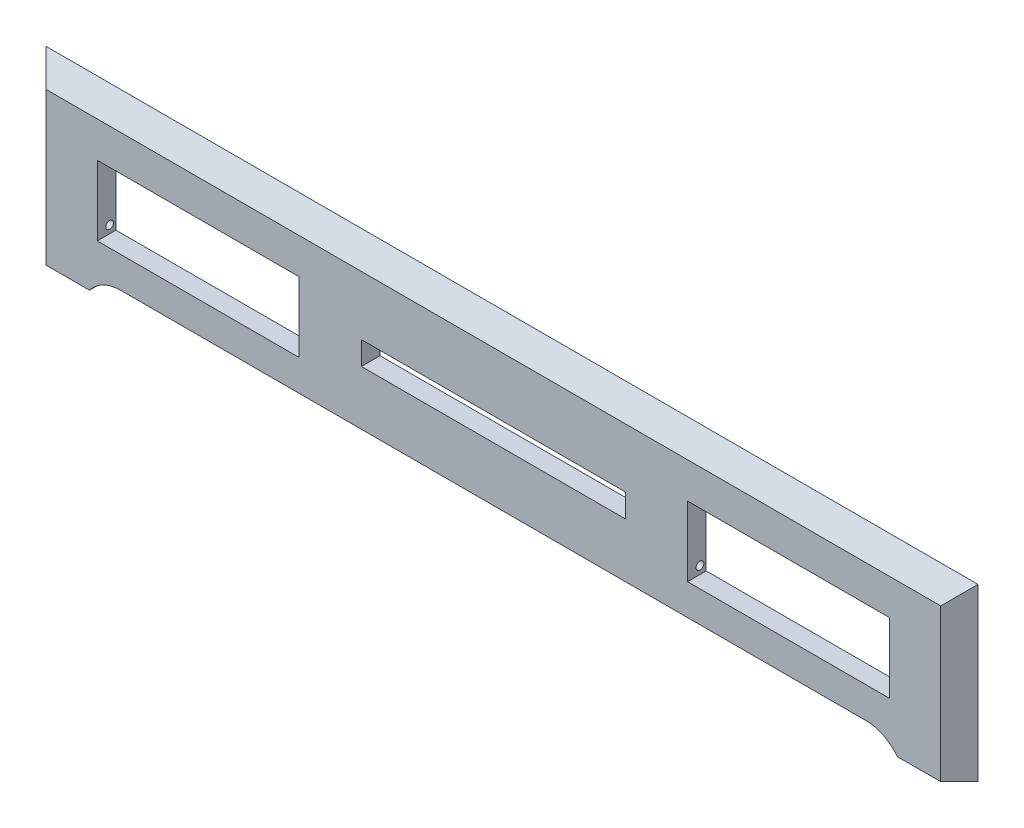
ISO-10303-21;
HEADER;
FILE_DESCRIPTION(('STEP AP214'),'2;1');
FILE_NAME('part.step','',(''),(''),'','','');
FILE_SCHEMA(('AUTOMOTIVE_DESIGN { 1 0 10303 214 1 1 1 1 }'));
ENDSEC;
DATA;
#1=APPLICATION_CONTEXT('core data for automotive mechanical design processes');
#2=APPLICATION_PROTOCOL_DEFINITION('international standard','automotive_design',2000,#1);
#3=PRODUCT_CONTEXT('',#1,'mechanical');
#4=PRODUCT('Part','Part','',(#3));
#5=PRODUCT_RELATED_PRODUCT_CATEGORY('part','',(#4));
#6=PRODUCT_DEFINITION_FORMATION('','',#4);
#7=PRODUCT_DEFINITION_CONTEXT('part definition',#1,'design');
#8=PRODUCT_DEFINITION('design','',#6,#7);
#9=PRODUCT_DEFINITION_SHAPE('','',#8);
#10=(LENGTH_UNIT() NAMED_UNIT(*) SI_UNIT(.MILLI.,.METRE.));
#11=(NAMED_UNIT(*) PLANE_ANGLE_UNIT() SI_UNIT($,.RADIAN.));
#12=(NAMED_UNIT(*) SI_UNIT($,.STERADIAN.) SOLID_ANGLE_UNIT());
#13=UNCERTAINTY_MEASURE_WITH_UNIT(LENGTH_MEASURE(1.E-05),#10,'distance_accuracy_value','');
#14=(GEOMETRIC_REPRESENTATION_CONTEXT(3) GLOBAL_UNCERTAINTY_ASSIGNED_CONTEXT((#13)) GLOBAL_UNIT_ASSIGNED_CONTEXT((#10,
#11,#12)) REPRESENTATION_CONTEXT('',''));
#15=CARTESIAN_POINT('',(0.,0.,0.));
#16=DIRECTION('',(0.,0.,1.));
#17=DIRECTION('',(1.,0.,0.));
#18=AXIS2_PLACEMENT_3D('',#15,#16,#17);
#19=CARTESIAN_POINT('',(0.,-10.,12.));
#20=DIRECTION('',(0.,1.,0.));
#21=DIRECTION('',(-1.,0.,0.));
#22=AXIS2_PLACEMENT_3D('',#19,#20,#21);
#23=PLANE('',#22);
#24=DIRECTION('',(1.,0.,0.));
#25=VECTOR('',#24,1.);
#26=CARTESIAN_POINT('',(0.,-10.,12.));
#27=LINE('',#26,#25);
#28=CARTESIAN_POINT('',(12.0000000000001,-10.,12.));
#29=VERTEX_POINT('',#28);
#30=CARTESIAN_POINT('',(40.,-10.,12.));
#31=VERTEX_POINT('',#30);
#32=EDGE_CURVE('E335',#29,#31,#27,.T.);
#33=ORIENTED_EDGE('',*,*,#32,.F.);
#34=DIRECTION('',(-0.707106781186547,0.,-0.707106781186548));
#35=VECTOR('',#34,1.);
#36=CARTESIAN_POINT('',(12.0000000000001,-10.,12.));
#37=LINE('',#36,#35);
#38=CARTESIAN_POINT('',(0.,-10.,0.));
#39=VERTEX_POINT('',#38);
#40=EDGE_CURVE('E13',#29,#39,#37,.T.);
#41=ORIENTED_EDGE('',*,*,#40,.T.);
#42=DIRECTION('',(1.,0.,0.));
#43=VECTOR('',#42,1.);
#44=CARTESIAN_POINT('',(0.,-10.,0.));
#45=LINE('',#44,#43);
#46=CARTESIAN_POINT('',(40.,-10.,0.));
#47=VERTEX_POINT('',#46);
#48=EDGE_CURVE('E356',#39,#47,#45,.T.);
#49=ORIENTED_EDGE('',*,*,#48,.T.);
#50=DIRECTION('',(0.,0.,-1.));
#51=VECTOR('',#50,1.);
#52=CARTESIAN_POINT('',(40.,-10.,12.));
#53=LINE('',#52,#51);
#54=EDGE_CURVE('E389',#31,#47,#53,.T.);
#55=ORIENTED_EDGE('',*,*,#54,.F.);
#56=EDGE_LOOP('',(#33,#41,#49,#55));
#57=FACE_BOUND('',#56,.T.);
#58=ADVANCED_FACE('F45',(#57),#23,.F.);
#59=CARTESIAN_POINT('',(60.,-25.,12.));
#60=DIRECTION('',(0.,0.,-1.));
#61=DIRECTION('',(-1.,0.,0.));
#62=AXIS2_PLACEMENT_3D('',#59,#60,#61);
#63=CYLINDRICAL_SURFACE('',#62,25.);
#64=CARTESIAN_POINT('',(60.,-25.,0.));
#65=DIRECTION('',(0.,0.,-1.));
#66=DIRECTION('',(-1.,0.,0.));
#67=AXIS2_PLACEMENT_3D('',#64,#65,#66);
#68=CIRCLE('',#67,25.);
#69=CARTESIAN_POINT('',(60.,0.,0.));
#70=VERTEX_POINT('',#69);
#71=EDGE_CURVE('E359',#47,#70,#68,.T.);
#72=ORIENTED_EDGE('',*,*,#71,.T.);
#73=DIRECTION('',(0.,0.,-1.));
#74=VECTOR('',#73,1.);
#75=CARTESIAN_POINT('',(60.,0.,12.));
#76=LINE('',#75,#74);
#77=CARTESIAN_POINT('',(60.,0.,12.));
#78=VERTEX_POINT('',#77);
#79=EDGE_CURVE('E385',#78,#70,#76,.T.);
#80=ORIENTED_EDGE('',*,*,#79,.F.);
#81=CARTESIAN_POINT('',(60.,-25.,12.));
#82=DIRECTION('',(0.,0.,-1.));
#83=DIRECTION('',(-1.,0.,0.));
#84=AXIS2_PLACEMENT_3D('',#81,#82,#83);
#85=CIRCLE('',#84,25.);
#86=EDGE_CURVE('E338',#31,#78,#85,.T.);
#87=ORIENTED_EDGE('',*,*,#86,.F.);
#88=ORIENTED_EDGE('',*,*,#54,.T.);
#89=EDGE_LOOP('',(#72,#80,#87,#88));
#90=FACE_BOUND('',#89,.T.);
#91=ADVANCED_FACE('F454',(#90),#63,.F.);
#92=CARTESIAN_POINT('',(60.,0.,12.));
#93=DIRECTION('',(0.,1.,0.));
#94=DIRECTION('',(0.,0.,1.));
#95=AXIS2_PLACEMENT_3D('',#92,#93,#94);
#96=PLANE('',#95);
#97=DIRECTION('',(1.,0.,0.));
#98=VECTOR('',#97,1.);
#99=CARTESIAN_POINT('',(60.,0.,0.));
#100=LINE('',#99,#98);
#101=CARTESIAN_POINT('',(540.,0.,0.));
#102=VERTEX_POINT('',#101);
#103=EDGE_CURVE('E362',#70,#102,#100,.T.);
#104=ORIENTED_EDGE('',*,*,#103,.T.);
#105=DIRECTION('',(0.,0.,-1.));
#106=VECTOR('',#105,1.);
#107=CARTESIAN_POINT('',(540.,0.,12.));
#108=LINE('',#107,#106);
#109=CARTESIAN_POINT('',(540.,0.,12.));
#110=VERTEX_POINT('',#109);
#111=EDGE_CURVE('E381',#110,#102,#108,.T.);
#112=ORIENTED_EDGE('',*,*,#111,.F.);
#113=DIRECTION('',(1.,0.,0.));
#114=VECTOR('',#113,1.);
#115=CARTESIAN_POINT('',(60.,0.,12.));
#116=LINE('',#115,#114);
#117=EDGE_CURVE('E342',#78,#110,#116,.T.);
#118=ORIENTED_EDGE('',*,*,#117,.F.);
#119=ORIENTED_EDGE('',*,*,#79,.T.);
#120=EDGE_LOOP('',(#104,#112,#118,#119));
#121=FACE_BOUND('',#120,.T.);
#122=ADVANCED_FACE('F460',(#121),#96,.F.);
#123=CARTESIAN_POINT('',(540.,-25.,12.));
#124=DIRECTION('',(0.,0.,-1.));
#125=DIRECTION('',(-1.,0.,0.));
#126=AXIS2_PLACEMENT_3D('',#123,#124,#125);
#127=CYLINDRICAL_SURFACE('',#126,25.);
#128=CARTESIAN_POINT('',(540.,-25.,0.));
#129=DIRECTION('',(0.,0.,-1.));
#130=DIRECTION('',(1.,0.,0.));
#131=AXIS2_PLACEMENT_3D('',#128,#129,#130);
#132=CIRCLE('',#131,25.);
#133=CARTESIAN_POINT('',(560.,-10.,0.));
#134=VERTEX_POINT('',#133);
#135=EDGE_CURVE('E365',#102,#134,#132,.T.);
#136=ORIENTED_EDGE('',*,*,#135,.T.);
#137=DIRECTION('',(0.,0.,-1.));
#138=VECTOR('',#137,1.);
#139=CARTESIAN_POINT('',(560.,-10.,12.));
#140=LINE('',#139,#138);
#141=CARTESIAN_POINT('',(560.,-10.,12.));
#142=VERTEX_POINT('',#141);
#143=EDGE_CURVE('E352',#142,#134,#140,.T.);
#144=ORIENTED_EDGE('',*,*,#143,.F.);
#145=CARTESIAN_POINT('',(540.,-25.,12.));
#146=DIRECTION('',(0.,0.,-1.));
#147=DIRECTION('',(1.,0.,0.));
#148=AXIS2_PLACEMENT_3D('',#145,#146,#147);
#149=CIRCLE('',#148,25.);
#150=EDGE_CURVE('E345',#110,#142,#149,.T.);
#151=ORIENTED_EDGE('',*,*,#150,.F.);
#152=ORIENTED_EDGE('',*,*,#111,.T.);
#153=EDGE_LOOP('',(#136,#144,#151,#152));
#154=FACE_BOUND('',#153,.T.);
#155=ADVANCED_FACE('F498',(#154),#127,.F.);
#156=CARTESIAN_POINT('',(600.,-10.,12.));
#157=DIRECTION('',(0.,1.,0.));
#158=DIRECTION('',(-1.,0.,0.));
#159=AXIS2_PLACEMENT_3D('',#156,#157,#158);
#160=PLANE('',#159);
#161=DIRECTION('',(1.,0.,0.));
#162=VECTOR('',#161,1.);
#163=CARTESIAN_POINT('',(600.,-10.,0.));
#164=LINE('',#163,#162);
#165=CARTESIAN_POINT('',(600.,-10.,0.));
#166=VERTEX_POINT('',#165);
#167=EDGE_CURVE('E368',#134,#166,#164,.T.);
#168=ORIENTED_EDGE('',*,*,#167,.T.);
#169=DIRECTION('',(-0.707106781186548,0.,0.707106781186548));
#170=VECTOR('',#169,1.);
#171=CARTESIAN_POINT('',(588.,-10.,12.));
#172=LINE('',#171,#170);
#173=CARTESIAN_POINT('',(588.,-10.,12.));
#174=VERTEX_POINT('',#173);
#175=EDGE_CURVE('E56',#166,#174,#172,.T.);
#176=ORIENTED_EDGE('',*,*,#175,.T.);
#177=DIRECTION('',(1.,0.,0.));
#178=VECTOR('',#177,1.);
#179=CARTESIAN_POINT('',(600.,-10.,12.));
#180=LINE('',#179,#178);
#181=EDGE_CURVE('E348',#142,#174,#180,.T.);
#182=ORIENTED_EDGE('',*,*,#181,.F.);
#183=ORIENTED_EDGE('',*,*,#143,.T.);
#184=EDGE_LOOP('',(#168,#176,#182,#183));
#185=FACE_BOUND('',#184,.T.);
#186=ADVANCED_FACE('F502',(#185),#160,.F.);
#187=CARTESIAN_POINT('',(540.,-25.,12.));
#188=DIRECTION('',(0.,0.,1.));
#189=DIRECTION('',(1.,0.,0.));
#190=AXIS2_PLACEMENT_3D('',#187,#188,#189);
#191=PLANE('',#190);
#192=DIRECTION('',(0.,-1.,0.));
#193=VECTOR('',#192,1.);
#194=CARTESIAN_POINT('',(45.,65.,12.));
#195=LINE('',#194,#193);
#196=CARTESIAN_POINT('',(45.,65.,12.));
#197=VERTEX_POINT('',#196);
#198=CARTESIAN_POINT('',(45.,20.,12.));
#199=VERTEX_POINT('',#198);
#200=EDGE_CURVE('E194',#197,#199,#195,.T.);
#201=ORIENTED_EDGE('',*,*,#200,.F.);
#202=DIRECTION('',(-1.,0.,0.));
#203=VECTOR('',#202,1.);
#204=CARTESIAN_POINT('',(45.,65.,12.));
#205=LINE('',#204,#203);
#206=CARTESIAN_POINT('',(175.,65.,12.));
#207=VERTEX_POINT('',#206);
#208=EDGE_CURVE('E215',#207,#197,#205,.T.);
#209=ORIENTED_EDGE('',*,*,#208,.F.);
#210=DIRECTION('',(0.,1.,0.));
#211=VECTOR('',#210,1.);
#212=CARTESIAN_POINT('',(175.,65.,12.));
#213=LINE('',#212,#211);
#214=CARTESIAN_POINT('',(175.,20.,12.));
#215=VERTEX_POINT('',#214);
#216=EDGE_CURVE('E219',#215,#207,#213,.T.);
#217=ORIENTED_EDGE('',*,*,#216,.F.);
#218=DIRECTION('',(1.,0.,0.));
#219=VECTOR('',#218,1.);
#220=CARTESIAN_POINT('',(45.,20.,12.));
#221=LINE('',#220,#219);
#222=EDGE_CURVE('E231',#199,#215,#221,.T.);
#223=ORIENTED_EDGE('',*,*,#222,.F.);
#224=EDGE_LOOP('',(#201,#209,#217,#223));
#225=FACE_BOUND('',#224,.T.);
#226=DIRECTION('',(0.,-1.,0.));
#227=VECTOR('',#226,1.);
#228=CARTESIAN_POINT('',(215.,50.,12.));
#229=LINE('',#228,#227);
#230=CARTESIAN_POINT('',(215.,50.,12.));
#231=VERTEX_POINT('',#230);
#232=CARTESIAN_POINT('',(215.,35.,12.));
#233=VERTEX_POINT('',#232);
#234=EDGE_CURVE('E265',#231,#233,#229,.T.);
#235=ORIENTED_EDGE('',*,*,#234,.F.);
#236=DIRECTION('',(-1.,0.,0.));
#237=VECTOR('',#236,1.);
#238=CARTESIAN_POINT('',(215.,50.,12.));
#239=LINE('',#238,#237);
#240=CARTESIAN_POINT('',(385.,50.,12.));
#241=VERTEX_POINT('',#240);
#242=EDGE_CURVE('E252',#241,#231,#239,.T.);
#243=ORIENTED_EDGE('',*,*,#242,.F.);
#244=DIRECTION('',(0.,1.,0.));
#245=VECTOR('',#244,1.);
#246=CARTESIAN_POINT('',(385.,50.,12.));
#247=LINE('',#246,#245);
#248=CARTESIAN_POINT('',(385.,35.,12.));
#249=VERTEX_POINT('',#248);
#250=EDGE_CURVE('E273',#249,#241,#247,.T.);
#251=ORIENTED_EDGE('',*,*,#250,.F.);
#252=DIRECTION('',(1.,0.,0.));
#253=VECTOR('',#252,1.);
#254=CARTESIAN_POINT('',(215.,35.,12.));
#255=LINE('',#254,#253);
#256=EDGE_CURVE('E268',#233,#249,#255,.T.);
#257=ORIENTED_EDGE('',*,*,#256,.F.);
#258=EDGE_LOOP('',(#235,#243,#251,#257));
#259=FACE_BOUND('',#258,.T.);
#260=DIRECTION('',(0.,-1.,0.));
#261=VECTOR('',#260,1.);
#262=CARTESIAN_POINT('',(425.,65.,12.));
#263=LINE('',#262,#261);
#264=CARTESIAN_POINT('',(425.,65.,12.));
#265=VERTEX_POINT('',#264);
#266=CARTESIAN_POINT('',(425.,20.,12.));
#267=VERTEX_POINT('',#266);
#268=EDGE_CURVE('E309',#265,#267,#263,.T.);
#269=ORIENTED_EDGE('',*,*,#268,.F.);
#270=DIRECTION('',(-1.,0.,0.));
#271=VECTOR('',#270,1.);
#272=CARTESIAN_POINT('',(425.,65.,12.));
#273=LINE('',#272,#271);
#274=CARTESIAN_POINT('',(555.,65.,12.));
#275=VERTEX_POINT('',#274);
#276=EDGE_CURVE('E296',#275,#265,#273,.T.);
#277=ORIENTED_EDGE('',*,*,#276,.F.);
#278=DIRECTION('',(0.,1.,0.));
#279=VECTOR('',#278,1.);
#280=CARTESIAN_POINT('',(555.,65.,12.));
#281=LINE('',#280,#279);
#282=CARTESIAN_POINT('',(555.,20.,12.));
#283=VERTEX_POINT('',#282);
#284=EDGE_CURVE('E317',#283,#275,#281,.T.);
#285=ORIENTED_EDGE('',*,*,#284,.F.);
#286=DIRECTION('',(1.,0.,0.));
#287=VECTOR('',#286,1.);
#288=CARTESIAN_POINT('',(425.,20.,12.));
#289=LINE('',#288,#287);
#290=EDGE_CURVE('E312',#267,#283,#289,.T.);
#291=ORIENTED_EDGE('',*,*,#290,.F.);
#292=EDGE_LOOP('',(#269,#277,#285,#291));
#293=FACE_BOUND('',#292,.T.);
#294=ORIENTED_EDGE('',*,*,#181,.T.);
#295=DIRECTION('',(0.,1.,0.));
#296=VECTOR('',#295,1.);
#297=CARTESIAN_POINT('',(588.,100.,12.));
#298=LINE('',#297,#296);
#299=CARTESIAN_POINT('',(588.,87.9999999999999,12.));
#300=VERTEX_POINT('',#299);
#301=EDGE_CURVE('E398',#174,#300,#298,.T.);
#302=ORIENTED_EDGE('',*,*,#301,.T.);
#303=DIRECTION('',(-1.,0.,0.));
#304=VECTOR('',#303,1.);
#305=CARTESIAN_POINT('',(0.,87.9999999999999,12.));
#306=LINE('',#305,#304);
#307=CARTESIAN_POINT('',(12.0000000000001,87.9999999999999,12.));
#308=VERTEX_POINT('',#307);
#309=EDGE_CURVE('E71',#300,#308,#306,.T.);
#310=ORIENTED_EDGE('',*,*,#309,.T.);
#311=DIRECTION('',(0.,-1.,0.));
#312=VECTOR('',#311,1.);
#313=CARTESIAN_POINT('',(12.0000000000001,-10.,12.));
#314=LINE('',#313,#312);
#315=EDGE_CURVE('E393',#308,#29,#314,.T.);
#316=ORIENTED_EDGE('',*,*,#315,.T.);
#317=ORIENTED_EDGE('',*,*,#32,.T.);
#318=ORIENTED_EDGE('',*,*,#86,.T.);
#319=ORIENTED_EDGE('',*,*,#117,.T.);
#320=ORIENTED_EDGE('',*,*,#150,.T.);
#321=EDGE_LOOP('',(#294,#302,#310,#316,#317,#318,#319,#320));
#322=FACE_BOUND('',#321,.T.);
#323=ADVANCED_FACE('F484',(#225,#259,#293,#322),#191,.T.);
#324=CARTESIAN_POINT('',(540.,-25.,0.));
#325=DIRECTION('',(0.,0.,1.));
#326=DIRECTION('',(1.,0.,0.));
#327=AXIS2_PLACEMENT_3D('',#324,#325,#326);
#328=PLANE('',#327);
#329=DIRECTION('',(-1.,0.,0.));
#330=VECTOR('',#329,1.);
#331=CARTESIAN_POINT('',(45.,65.,0.));
#332=LINE('',#331,#330);
#333=CARTESIAN_POINT('',(175.,65.,0.));
#334=VERTEX_POINT('',#333);
#335=CARTESIAN_POINT('',(45.,65.,0.));
#336=VERTEX_POINT('',#335);
#337=EDGE_CURVE('E200',#334,#336,#332,.T.);
#338=ORIENTED_EDGE('',*,*,#337,.T.);
#339=DIRECTION('',(0.,-1.,0.));
#340=VECTOR('',#339,1.);
#341=CARTESIAN_POINT('',(45.,65.,0.));
#342=LINE('',#341,#340);
#343=CARTESIAN_POINT('',(45.,20.,0.));
#344=VERTEX_POINT('',#343);
#345=EDGE_CURVE('E191',#336,#344,#342,.T.);
#346=ORIENTED_EDGE('',*,*,#345,.T.);
#347=DIRECTION('',(1.,0.,0.));
#348=VECTOR('',#347,1.);
#349=CARTESIAN_POINT('',(45.,20.,0.));
#350=LINE('',#349,#348);
#351=CARTESIAN_POINT('',(175.,20.,0.));
#352=VERTEX_POINT('',#351);
#353=EDGE_CURVE('E204',#344,#352,#350,.T.);
#354=ORIENTED_EDGE('',*,*,#353,.T.);
#355=DIRECTION('',(0.,1.,0.));
#356=VECTOR('',#355,1.);
#357=CARTESIAN_POINT('',(175.,65.,0.));
#358=LINE('',#357,#356);
#359=EDGE_CURVE('E209',#352,#334,#358,.T.);
#360=ORIENTED_EDGE('',*,*,#359,.T.);
#361=EDGE_LOOP('',(#338,#346,#354,#360));
#362=FACE_BOUND('',#361,.T.);
#363=DIRECTION('',(-1.,0.,0.));
#364=VECTOR('',#363,1.);
#365=CARTESIAN_POINT('',(215.,50.,0.));
#366=LINE('',#365,#364);
#367=CARTESIAN_POINT('',(385.,50.,0.));
#368=VERTEX_POINT('',#367);
#369=CARTESIAN_POINT('',(215.,50.,0.));
#370=VERTEX_POINT('',#369);
#371=EDGE_CURVE('E260',#368,#370,#366,.T.);
#372=ORIENTED_EDGE('',*,*,#371,.T.);
#373=DIRECTION('',(0.,-1.,0.));
#374=VECTOR('',#373,1.);
#375=CARTESIAN_POINT('',(215.,50.,0.));
#376=LINE('',#375,#374);
#377=CARTESIAN_POINT('',(215.,35.,0.));
#378=VERTEX_POINT('',#377);
#379=EDGE_CURVE('E247',#370,#378,#376,.T.);
#380=ORIENTED_EDGE('',*,*,#379,.T.);
#381=DIRECTION('',(1.,0.,0.));
#382=VECTOR('',#381,1.);
#383=CARTESIAN_POINT('',(215.,35.,0.));
#384=LINE('',#383,#382);
#385=CARTESIAN_POINT('',(385.,35.,0.));
#386=VERTEX_POINT('',#385);
#387=EDGE_CURVE('E251',#378,#386,#384,.T.);
#388=ORIENTED_EDGE('',*,*,#387,.T.);
#389=DIRECTION('',(0.,1.,0.));
#390=VECTOR('',#389,1.);
#391=CARTESIAN_POINT('',(385.,50.,0.));
#392=LINE('',#391,#390);
#393=EDGE_CURVE('E256',#386,#368,#392,.T.);
#394=ORIENTED_EDGE('',*,*,#393,.T.);
#395=EDGE_LOOP('',(#372,#380,#388,#394));
#396=FACE_BOUND('',#395,.T.);
#397=DIRECTION('',(-1.,0.,0.));
#398=VECTOR('',#397,1.);
#399=CARTESIAN_POINT('',(425.,65.,0.));
#400=LINE('',#399,#398);
#401=CARTESIAN_POINT('',(555.,65.,0.));
#402=VERTEX_POINT('',#401);
#403=CARTESIAN_POINT('',(425.,65.,0.));
#404=VERTEX_POINT('',#403);
#405=EDGE_CURVE('E304',#402,#404,#400,.T.);
#406=ORIENTED_EDGE('',*,*,#405,.T.);
#407=DIRECTION('',(0.,-1.,0.));
#408=VECTOR('',#407,1.);
#409=CARTESIAN_POINT('',(425.,65.,0.));
#410=LINE('',#409,#408);
#411=CARTESIAN_POINT('',(425.,20.,0.));
#412=VERTEX_POINT('',#411);
#413=EDGE_CURVE('E291',#404,#412,#410,.T.);
#414=ORIENTED_EDGE('',*,*,#413,.T.);
#415=DIRECTION('',(1.,0.,0.));
#416=VECTOR('',#415,1.);
#417=CARTESIAN_POINT('',(425.,20.,0.));
#418=LINE('',#417,#416);
#419=CARTESIAN_POINT('',(555.,20.,0.));
#420=VERTEX_POINT('',#419);
#421=EDGE_CURVE('E295',#412,#420,#418,.T.);
#422=ORIENTED_EDGE('',*,*,#421,.T.);
#423=DIRECTION('',(0.,1.,0.));
#424=VECTOR('',#423,1.);
#425=CARTESIAN_POINT('',(555.,65.,0.));
#426=LINE('',#425,#424);
#427=EDGE_CURVE('E300',#420,#402,#426,.T.);
#428=ORIENTED_EDGE('',*,*,#427,.T.);
#429=EDGE_LOOP('',(#406,#414,#422,#428));
#430=FACE_BOUND('',#429,.T.);
#431=DIRECTION('',(0.,-1.,0.));
#432=VECTOR('',#431,1.);
#433=CARTESIAN_POINT('',(0.,0.,0.));
#434=LINE('',#433,#432);
#435=CARTESIAN_POINT('',(0.,100.,0.));
#436=VERTEX_POINT('',#435);
#437=EDGE_CURVE('E241',#436,#39,#434,.T.);
#438=ORIENTED_EDGE('',*,*,#437,.F.);
#439=DIRECTION('',(-1.,0.,0.));
#440=VECTOR('',#439,1.);
#441=CARTESIAN_POINT('',(0.,100.,0.));
#442=LINE('',#441,#440);
#443=CARTESIAN_POINT('',(600.,100.,0.));
#444=VERTEX_POINT('',#443);
#445=EDGE_CURVE('E339',#444,#436,#442,.T.);
#446=ORIENTED_EDGE('',*,*,#445,.F.);
#447=DIRECTION('',(0.,1.,0.));
#448=VECTOR('',#447,1.);
#449=CARTESIAN_POINT('',(600.,0.,0.));
#450=LINE('',#449,#448);
#451=EDGE_CURVE('E372',#166,#444,#450,.T.);
#452=ORIENTED_EDGE('',*,*,#451,.F.);
#453=ORIENTED_EDGE('',*,*,#167,.F.);
#454=ORIENTED_EDGE('',*,*,#135,.F.);
#455=ORIENTED_EDGE('',*,*,#103,.F.);
#456=ORIENTED_EDGE('',*,*,#71,.F.);
#457=ORIENTED_EDGE('',*,*,#48,.F.);
#458=EDGE_LOOP('',(#438,#446,#452,#453,#454,#455,#456,#457));
#459=FACE_BOUND('',#458,.T.);
#460=ADVANCED_FACE('F211',(#362,#396,#430,#459),#328,.F.);
#461=CARTESIAN_POINT('',(425.,65.,0.));
#462=DIRECTION('',(-1.,0.,0.));
#463=DIRECTION('',(0.,0.,1.));
#464=AXIS2_PLACEMENT_3D('',#461,#462,#463);
#465=PLANE('',#464);
#466=CARTESIAN_POINT('',(425.,25.,4.));
#467=DIRECTION('',(-1.,0.,0.));
#468=DIRECTION('',(0.,0.,1.));
#469=AXIS2_PLACEMENT_3D('',#466,#467,#468);
#470=CIRCLE('',#469,2.5);
#471=CARTESIAN_POINT('',(425.,25.,6.5));
#472=VERTEX_POINT('',#471);
#473=EDGE_CURVE('E422',#472,#472,#470,.T.);
#474=ORIENTED_EDGE('',*,*,#473,.T.);
#475=EDGE_LOOP('',(#474));
#476=FACE_BOUND('',#475,.T.);
#477=ORIENTED_EDGE('',*,*,#268,.T.);
#478=DIRECTION('',(0.,0.,1.));
#479=VECTOR('',#478,1.);
#480=CARTESIAN_POINT('',(425.,20.,0.));
#481=LINE('',#480,#479);
#482=EDGE_CURVE('E308',#412,#267,#481,.T.);
#483=ORIENTED_EDGE('',*,*,#482,.F.);
#484=ORIENTED_EDGE('',*,*,#413,.F.);
#485=DIRECTION('',(0.,0.,1.));
#486=VECTOR('',#485,1.);
#487=CARTESIAN_POINT('',(425.,65.,0.));
#488=LINE('',#487,#486);
#489=EDGE_CURVE('E269',#404,#265,#488,.T.);
#490=ORIENTED_EDGE('',*,*,#489,.T.);
#491=EDGE_LOOP('',(#477,#483,#484,#490));
#492=FACE_BOUND('',#491,.T.);
#493=ADVANCED_FACE('F506',(#476,#492),#465,.F.);
#494=CARTESIAN_POINT('',(425.,65.,0.));
#495=DIRECTION('',(0.,1.,0.));
#496=DIRECTION('',(0.,0.,1.));
#497=AXIS2_PLACEMENT_3D('',#494,#495,#496);
#498=PLANE('',#497);
#499=ORIENTED_EDGE('',*,*,#276,.T.);
#500=ORIENTED_EDGE('',*,*,#489,.F.);
#501=ORIENTED_EDGE('',*,*,#405,.F.);
#502=DIRECTION('',(0.,0.,1.));
#503=VECTOR('',#502,1.);
#504=CARTESIAN_POINT('',(555.,65.,0.));
#505=LINE('',#504,#503);
#506=EDGE_CURVE('E326',#402,#275,#505,.T.);
#507=ORIENTED_EDGE('',*,*,#506,.T.);
#508=EDGE_LOOP('',(#499,#500,#501,#507));
#509=FACE_BOUND('',#508,.T.);
#510=ADVANCED_FACE('F512',(#509),#498,.F.);
#511=CARTESIAN_POINT('',(555.,65.,0.));
#512=DIRECTION('',(1.,0.,0.));
#513=DIRECTION('',(0.,0.,-1.));
#514=AXIS2_PLACEMENT_3D('',#511,#512,#513);
#515=PLANE('',#514);
#516=CARTESIAN_POINT('',(555.,25.,4.));
#517=DIRECTION('',(1.,0.,0.));
#518=DIRECTION('',(0.,0.,-1.));
#519=AXIS2_PLACEMENT_3D('',#516,#517,#518);
#520=CIRCLE('',#519,2.5);
#521=CARTESIAN_POINT('',(555.,25.,1.5));
#522=VERTEX_POINT('',#521);
#523=EDGE_CURVE('E50',#522,#522,#520,.T.);
#524=ORIENTED_EDGE('',*,*,#523,.T.);
#525=EDGE_LOOP('',(#524));
#526=FACE_BOUND('',#525,.T.);
#527=ORIENTED_EDGE('',*,*,#284,.T.);
#528=ORIENTED_EDGE('',*,*,#506,.F.);
#529=ORIENTED_EDGE('',*,*,#427,.F.);
#530=DIRECTION('',(0.,0.,1.));
#531=VECTOR('',#530,1.);
#532=CARTESIAN_POINT('',(555.,20.,0.));
#533=LINE('',#532,#531);
#534=EDGE_CURVE('E329',#420,#283,#533,.T.);
#535=ORIENTED_EDGE('',*,*,#534,.T.);
#536=EDGE_LOOP('',(#527,#528,#529,#535));
#537=FACE_BOUND('',#536,.T.);
#538=ADVANCED_FACE('F632',(#526,#537),#515,.F.);
#539=CARTESIAN_POINT('',(425.,20.,0.));
#540=DIRECTION('',(0.,-1.,0.));
#541=DIRECTION('',(0.,0.,-1.));
#542=AXIS2_PLACEMENT_3D('',#539,#540,#541);
#543=PLANE('',#542);
#544=ORIENTED_EDGE('',*,*,#290,.T.);
#545=ORIENTED_EDGE('',*,*,#534,.F.);
#546=ORIENTED_EDGE('',*,*,#421,.F.);
#547=ORIENTED_EDGE('',*,*,#482,.T.);
#548=EDGE_LOOP('',(#544,#545,#546,#547));
#549=FACE_BOUND('',#548,.T.);
#550=ADVANCED_FACE('F636',(#549),#543,.F.);
#551=CARTESIAN_POINT('',(215.,50.,0.));
#552=DIRECTION('',(-1.,0.,0.));
#553=DIRECTION('',(0.,0.,1.));
#554=AXIS2_PLACEMENT_3D('',#551,#552,#553);
#555=PLANE('',#554);
#556=ORIENTED_EDGE('',*,*,#234,.T.);
#557=DIRECTION('',(0.,0.,1.));
#558=VECTOR('',#557,1.);
#559=CARTESIAN_POINT('',(215.,35.,0.));
#560=LINE('',#559,#558);
#561=EDGE_CURVE('E264',#378,#233,#560,.T.);
#562=ORIENTED_EDGE('',*,*,#561,.F.);
#563=ORIENTED_EDGE('',*,*,#379,.F.);
#564=DIRECTION('',(0.,0.,1.));
#565=VECTOR('',#564,1.);
#566=CARTESIAN_POINT('',(215.,50.,0.));
#567=LINE('',#566,#565);
#568=EDGE_CURVE('E232',#370,#231,#567,.T.);
#569=ORIENTED_EDGE('',*,*,#568,.T.);
#570=EDGE_LOOP('',(#556,#562,#563,#569));
#571=FACE_BOUND('',#570,.T.);
#572=ADVANCED_FACE('F679',(#571),#555,.F.);
#573=CARTESIAN_POINT('',(215.,50.,0.));
#574=DIRECTION('',(0.,1.,0.));
#575=DIRECTION('',(0.,0.,1.));
#576=AXIS2_PLACEMENT_3D('',#573,#574,#575);
#577=PLANE('',#576);
#578=ORIENTED_EDGE('',*,*,#242,.T.);
#579=ORIENTED_EDGE('',*,*,#568,.F.);
#580=ORIENTED_EDGE('',*,*,#371,.F.);
#581=DIRECTION('',(0.,0.,1.));
#582=VECTOR('',#581,1.);
#583=CARTESIAN_POINT('',(385.,50.,0.));
#584=LINE('',#583,#582);
#585=EDGE_CURVE('E282',#368,#241,#584,.T.);
#586=ORIENTED_EDGE('',*,*,#585,.T.);
#587=EDGE_LOOP('',(#578,#579,#580,#586));
#588=FACE_BOUND('',#587,.T.);
#589=ADVANCED_FACE('F675',(#588),#577,.F.);
#590=CARTESIAN_POINT('',(385.,50.,0.));
#591=DIRECTION('',(1.,0.,0.));
#592=DIRECTION('',(0.,0.,-1.));
#593=AXIS2_PLACEMENT_3D('',#590,#591,#592);
#594=PLANE('',#593);
#595=ORIENTED_EDGE('',*,*,#250,.T.);
#596=ORIENTED_EDGE('',*,*,#585,.F.);
#597=ORIENTED_EDGE('',*,*,#393,.F.);
#598=DIRECTION('',(0.,0.,1.));
#599=VECTOR('',#598,1.);
#600=CARTESIAN_POINT('',(385.,35.,0.));
#601=LINE('',#600,#599);
#602=EDGE_CURVE('E285',#386,#249,#601,.T.);
#603=ORIENTED_EDGE('',*,*,#602,.T.);
#604=EDGE_LOOP('',(#595,#596,#597,#603));
#605=FACE_BOUND('',#604,.T.);
#606=ADVANCED_FACE('F678',(#605),#594,.F.);
#607=CARTESIAN_POINT('',(215.,35.,0.));
#608=DIRECTION('',(0.,-1.,0.));
#609=DIRECTION('',(0.,0.,-1.));
#610=AXIS2_PLACEMENT_3D('',#607,#608,#609);
#611=PLANE('',#610);
#612=ORIENTED_EDGE('',*,*,#256,.T.);
#613=ORIENTED_EDGE('',*,*,#602,.F.);
#614=ORIENTED_EDGE('',*,*,#387,.F.);
#615=ORIENTED_EDGE('',*,*,#561,.T.);
#616=EDGE_LOOP('',(#612,#613,#614,#615));
#617=FACE_BOUND('',#616,.T.);
#618=ADVANCED_FACE('F574',(#617),#611,.F.);
#619=CARTESIAN_POINT('',(45.,65.,0.));
#620=DIRECTION('',(-1.,0.,0.));
#621=DIRECTION('',(0.,0.,1.));
#622=AXIS2_PLACEMENT_3D('',#619,#620,#621);
#623=PLANE('',#622);
#624=CARTESIAN_POINT('',(45.,25.,4.));
#625=DIRECTION('',(-1.,0.,0.));
#626=DIRECTION('',(0.,0.,1.));
#627=AXIS2_PLACEMENT_3D('',#624,#625,#626);
#628=CIRCLE('',#627,2.5);
#629=CARTESIAN_POINT('',(45.,25.,6.5));
#630=VERTEX_POINT('',#629);
#631=EDGE_CURVE('E222',#630,#630,#628,.F.);
#632=ORIENTED_EDGE('',*,*,#631,.F.);
#633=EDGE_LOOP('',(#632));
#634=FACE_BOUND('',#633,.T.);
#635=ORIENTED_EDGE('',*,*,#200,.T.);
#636=DIRECTION('',(0.,0.,1.));
#637=VECTOR('',#636,1.);
#638=CARTESIAN_POINT('',(45.,20.,0.));
#639=LINE('',#638,#637);
#640=EDGE_CURVE('E187',#344,#199,#639,.T.);
#641=ORIENTED_EDGE('',*,*,#640,.F.);
#642=ORIENTED_EDGE('',*,*,#345,.F.);
#643=DIRECTION('',(0.,0.,1.));
#644=VECTOR('',#643,1.);
#645=CARTESIAN_POINT('',(45.,65.,0.));
#646=LINE('',#645,#644);
#647=EDGE_CURVE('E238',#336,#197,#646,.T.);
#648=ORIENTED_EDGE('',*,*,#647,.T.);
#649=EDGE_LOOP('',(#635,#641,#642,#648));
#650=FACE_BOUND('',#649,.T.);
#651=ADVANCED_FACE('F189',(#634,#650),#623,.F.);
#652=CARTESIAN_POINT('',(45.,65.,0.));
#653=DIRECTION('',(0.,1.,0.));
#654=DIRECTION('',(-1.,0.,0.));
#655=AXIS2_PLACEMENT_3D('',#652,#653,#654);
#656=PLANE('',#655);
#657=ORIENTED_EDGE('',*,*,#208,.T.);
#658=ORIENTED_EDGE('',*,*,#647,.F.);
#659=ORIENTED_EDGE('',*,*,#337,.F.);
#660=DIRECTION('',(0.,0.,1.));
#661=VECTOR('',#660,1.);
#662=CARTESIAN_POINT('',(175.,65.,0.));
#663=LINE('',#662,#661);
#664=EDGE_CURVE('E242',#334,#207,#663,.T.);
#665=ORIENTED_EDGE('',*,*,#664,.T.);
#666=EDGE_LOOP('',(#657,#658,#659,#665));
#667=FACE_BOUND('',#666,.T.);
#668=ADVANCED_FACE('F573',(#667),#656,.F.);
#669=CARTESIAN_POINT('',(175.,65.,0.));
#670=DIRECTION('',(1.,0.,0.));
#671=DIRECTION('',(0.,0.,-1.));
#672=AXIS2_PLACEMENT_3D('',#669,#670,#671);
#673=PLANE('',#672);
#674=CARTESIAN_POINT('',(175.,25.,4.));
#675=DIRECTION('',(1.,0.,0.));
#676=DIRECTION('',(0.,0.,-1.));
#677=AXIS2_PLACEMENT_3D('',#674,#675,#676);
#678=CIRCLE('',#677,2.5);
#679=CARTESIAN_POINT('',(175.,25.,1.5));
#680=VERTEX_POINT('',#679);
#681=EDGE_CURVE('E407',#680,#680,#678,.F.);
#682=ORIENTED_EDGE('',*,*,#681,.F.);
#683=EDGE_LOOP('',(#682));
#684=FACE_BOUND('',#683,.T.);
#685=ORIENTED_EDGE('',*,*,#216,.T.);
#686=ORIENTED_EDGE('',*,*,#664,.F.);
#687=ORIENTED_EDGE('',*,*,#359,.F.);
#688=DIRECTION('',(0.,0.,1.));
#689=VECTOR('',#688,1.);
#690=CARTESIAN_POINT('',(175.,20.,0.));
#691=LINE('',#690,#689);
#692=EDGE_CURVE('E199',#352,#215,#691,.T.);
#693=ORIENTED_EDGE('',*,*,#692,.T.);
#694=EDGE_LOOP('',(#685,#686,#687,#693));
#695=FACE_BOUND('',#694,.T.);
#696=ADVANCED_FACE('F584',(#684,#695),#673,.F.);
#697=CARTESIAN_POINT('',(45.,20.,0.));
#698=DIRECTION('',(0.,-1.,0.));
#699=DIRECTION('',(1.,0.,0.));
#700=AXIS2_PLACEMENT_3D('',#697,#698,#699);
#701=PLANE('',#700);
#702=ORIENTED_EDGE('',*,*,#222,.T.);
#703=ORIENTED_EDGE('',*,*,#692,.F.);
#704=ORIENTED_EDGE('',*,*,#353,.F.);
#705=ORIENTED_EDGE('',*,*,#640,.T.);
#706=EDGE_LOOP('',(#702,#703,#704,#705));
#707=FACE_BOUND('',#706,.T.);
#708=ADVANCED_FACE('F205',(#707),#701,.F.);
#709=CARTESIAN_POINT('',(12.0000000000001,-25.0000000000001,12.));
#710=DIRECTION('',(-0.707106781186547,0.,0.707106781186547));
#711=DIRECTION('',(0.,1.,0.));
#712=AXIS2_PLACEMENT_3D('',#709,#710,#711);
#713=PLANE('',#712);
#714=ORIENTED_EDGE('',*,*,#40,.F.);
#715=ORIENTED_EDGE('',*,*,#315,.F.);
#716=DIRECTION('',(-0.577350269189626,0.577350269189626,-0.577350269189626));
#717=VECTOR('',#716,1.);
#718=CARTESIAN_POINT('',(49.6666666666668,50.3333333333332,49.6666666666667));
#719=LINE('',#718,#717);
#720=EDGE_CURVE('E313',#436,#308,#719,.F.);
#721=ORIENTED_EDGE('',*,*,#720,.F.);
#722=ORIENTED_EDGE('',*,*,#437,.T.);
#723=EDGE_LOOP('',(#714,#715,#721,#722));
#724=FACE_BOUND('',#723,.T.);
#725=ADVANCED_FACE('F48',(#724),#713,.T.);
#726=CARTESIAN_POINT('',(540.,87.9999999999999,12.));
#727=DIRECTION('',(0.,0.707106781186547,0.707106781186547));
#728=DIRECTION('',(1.,0.,0.));
#729=AXIS2_PLACEMENT_3D('',#726,#727,#728);
#730=PLANE('',#729);
#731=ORIENTED_EDGE('',*,*,#720,.T.);
#732=ORIENTED_EDGE('',*,*,#309,.F.);
#733=DIRECTION('',(0.577350269189626,0.577350269189626,-0.577350269189626));
#734=VECTOR('',#733,1.);
#735=CARTESIAN_POINT('',(572.,71.9999999999999,28.));
#736=LINE('',#735,#734);
#737=EDGE_CURVE('E64',#444,#300,#736,.F.);
#738=ORIENTED_EDGE('',*,*,#737,.F.);
#739=ORIENTED_EDGE('',*,*,#445,.T.);
#740=EDGE_LOOP('',(#731,#732,#738,#739));
#741=FACE_BOUND('',#740,.T.);
#742=ADVANCED_FACE('F473',(#741),#730,.T.);
#743=CARTESIAN_POINT('',(588.,-25.,12.));
#744=DIRECTION('',(0.707106781186547,0.,0.707106781186547));
#745=DIRECTION('',(0.,-1.,0.));
#746=AXIS2_PLACEMENT_3D('',#743,#744,#745);
#747=PLANE('',#746);
#748=ORIENTED_EDGE('',*,*,#175,.F.);
#749=ORIENTED_EDGE('',*,*,#451,.T.);
#750=ORIENTED_EDGE('',*,*,#737,.T.);
#751=ORIENTED_EDGE('',*,*,#301,.F.);
#752=EDGE_LOOP('',(#748,#749,#750,#751));
#753=FACE_BOUND('',#752,.T.);
#754=ADVANCED_FACE('F467',(#753),#747,.T.);
#755=CARTESIAN_POINT('',(185.,65.,0.));
#756=DIRECTION('',(1.,0.,0.));
#757=DIRECTION('',(0.,0.,-1.));
#758=AXIS2_PLACEMENT_3D('',#755,#756,#757);
#759=PLANE('',#758);
#760=CARTESIAN_POINT('',(185.,25.,4.));
#761=DIRECTION('',(1.,0.,0.));
#762=DIRECTION('',(0.,0.,-1.));
#763=AXIS2_PLACEMENT_3D('',#760,#761,#762);
#764=CIRCLE('',#763,2.5);
#765=CARTESIAN_POINT('',(185.,25.,1.5));
#766=VERTEX_POINT('',#765);
#767=EDGE_CURVE('E410',#766,#766,#764,.T.);
#768=ORIENTED_EDGE('',*,*,#767,.F.);
#769=EDGE_LOOP('',(#768));
#770=FACE_BOUND('',#769,.T.);
#771=ADVANCED_FACE('F472',(#770),#759,.F.);
#772=CARTESIAN_POINT('',(202.071067811866,25.,4.));
#773=DIRECTION('',(-1.,0.,0.));
#774=DIRECTION('',(0.,0.,1.));
#775=AXIS2_PLACEMENT_3D('',#772,#773,#774);
#776=CYLINDRICAL_SURFACE('',#775,2.5);
#777=ORIENTED_EDGE('',*,*,#767,.T.);
#778=EDGE_LOOP('',(#777));
#779=FACE_BOUND('',#778,.T.);
#780=ORIENTED_EDGE('',*,*,#681,.T.);
#781=EDGE_LOOP('',(#780));
#782=FACE_BOUND('',#781,.T.);
#783=ADVANCED_FACE('F596',(#779,#782),#776,.F.);
#784=CARTESIAN_POINT('',(35.,25.,4.));
#785=DIRECTION('',(1.,0.,0.));
#786=DIRECTION('',(0.,0.,-1.));
#787=AXIS2_PLACEMENT_3D('',#784,#785,#786);
#788=CIRCLE('',#787,2.5);
#789=CARTESIAN_POINT('',(35.,25.,1.5));
#790=VERTEX_POINT('',#789);
#791=EDGE_CURVE('E417',#790,#790,#788,.T.);
#792=ORIENTED_EDGE('',*,*,#791,.F.);
#793=EDGE_LOOP('',(#792));
#794=FACE_BOUND('',#793,.T.);
#795=ORIENTED_EDGE('',*,*,#631,.T.);
#796=EDGE_LOOP('',(#795));
#797=FACE_BOUND('',#796,.T.);
#798=ADVANCED_FACE('F450',(#794,#797),#776,.F.);
#799=CARTESIAN_POINT('',(35.,25.,4.));
#800=DIRECTION('',(1.,0.,0.));
#801=DIRECTION('',(0.,0.,-1.));
#802=AXIS2_PLACEMENT_3D('',#799,#800,#801);
#803=PLANE('',#802);
#804=ORIENTED_EDGE('',*,*,#791,.T.);
#805=EDGE_LOOP('',(#804));
#806=FACE_BOUND('',#805,.T.);
#807=ADVANCED_FACE('F442',(#806),#803,.T.);
#808=CARTESIAN_POINT('',(565.,25.,4.));
#809=DIRECTION('',(1.,0.,0.));
#810=DIRECTION('',(0.,0.,-1.));
#811=AXIS2_PLACEMENT_3D('',#808,#809,#810);
#812=PLANE('',#811);
#813=CARTESIAN_POINT('',(565.,25.,4.));
#814=DIRECTION('',(1.,0.,0.));
#815=DIRECTION('',(0.,0.,-1.));
#816=AXIS2_PLACEMENT_3D('',#813,#814,#815);
#817=CIRCLE('',#816,2.5);
#818=CARTESIAN_POINT('',(565.,25.,1.5));
#819=VERTEX_POINT('',#818);
#820=EDGE_CURVE('E432',#819,#819,#817,.T.);
#821=ORIENTED_EDGE('',*,*,#820,.F.);
#822=EDGE_LOOP('',(#821));
#823=FACE_BOUND('',#822,.T.);
#824=ADVANCED_FACE('F440',(#823),#812,.F.);
#825=CARTESIAN_POINT('',(397.928932188134,25.,4.));
#826=DIRECTION('',(1.,0.,0.));
#827=DIRECTION('',(0.,0.,-1.));
#828=AXIS2_PLACEMENT_3D('',#825,#826,#827);
#829=CYLINDRICAL_SURFACE('',#828,2.5);
#830=ORIENTED_EDGE('',*,*,#820,.T.);
#831=EDGE_LOOP('',(#830));
#832=FACE_BOUND('',#831,.T.);
#833=ORIENTED_EDGE('',*,*,#523,.F.);
#834=EDGE_LOOP('',(#833));
#835=FACE_BOUND('',#834,.T.);
#836=ADVANCED_FACE('F437',(#832,#835),#829,.F.);
#837=CARTESIAN_POINT('',(415.,25.,4.));
#838=DIRECTION('',(-1.,0.,0.));
#839=DIRECTION('',(0.,0.,1.));
#840=AXIS2_PLACEMENT_3D('',#837,#838,#839);
#841=CIRCLE('',#840,2.5);
#842=CARTESIAN_POINT('',(415.,25.,6.5));
#843=VERTEX_POINT('',#842);
#844=EDGE_CURVE('E428',#843,#843,#841,.F.);
#845=ORIENTED_EDGE('',*,*,#844,.F.);
#846=EDGE_LOOP('',(#845));
#847=FACE_BOUND('',#846,.T.);
#848=ORIENTED_EDGE('',*,*,#473,.F.);
#849=EDGE_LOOP('',(#848));
#850=FACE_BOUND('',#849,.T.);
#851=ADVANCED_FACE('F448',(#847,#850),#829,.F.);
#852=CARTESIAN_POINT('',(415.,65.,0.));
#853=DIRECTION('',(-1.,0.,0.));
#854=DIRECTION('',(0.,0.,1.));
#855=AXIS2_PLACEMENT_3D('',#852,#853,#854);
#856=PLANE('',#855);
#857=ORIENTED_EDGE('',*,*,#844,.T.);
#858=EDGE_LOOP('',(#857));
#859=FACE_BOUND('',#858,.T.);
#860=ADVANCED_FACE('F658',(#859),#856,.F.);
#861=CLOSED_SHELL('',(#58,#91,#122,#155,#186,#323,#460,#493,#510,#538,#550,#572,#589,#606,#618,
#651,#668,#696,#708,#725,#742,#754,#771,#783,#798,#807,#824,#836,#851,#860));
#862=MANIFOLD_SOLID_BREP('B2',#861);
#863=ADVANCED_BREP_SHAPE_REPRESENTATION('',(#18,#862),#14);
#864=SHAPE_DEFINITION_REPRESENTATION(#9,#863);
ENDSEC;
END-ISO-10303-21;
